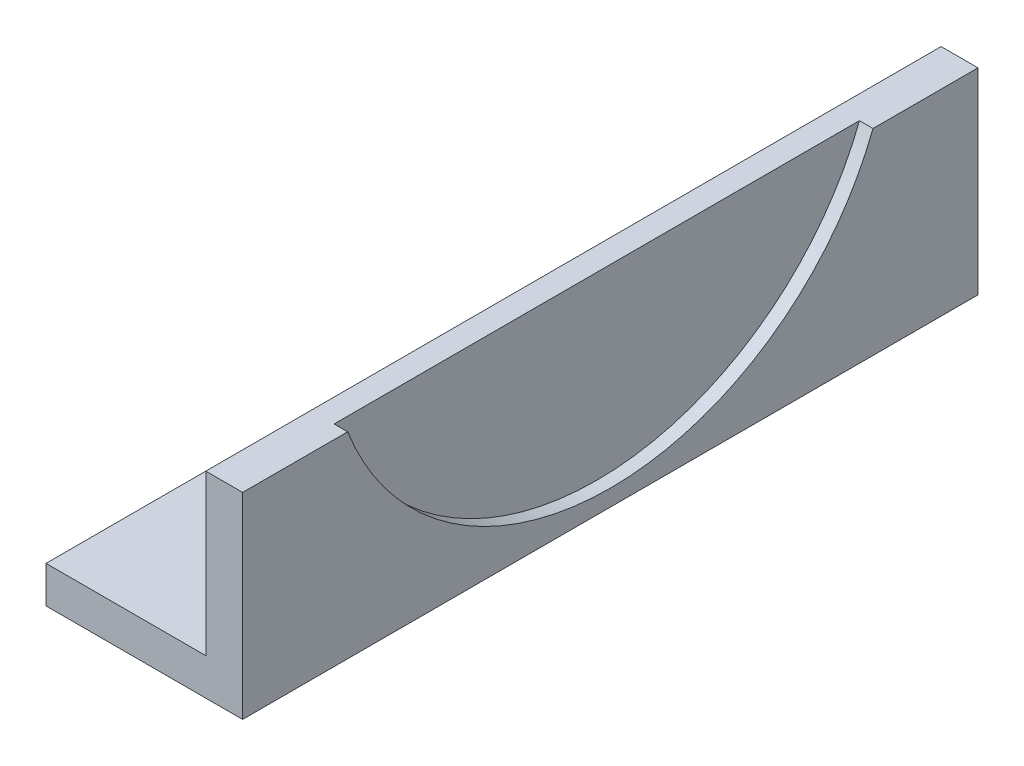
ISO-10303-21;
HEADER;
FILE_DESCRIPTION(('STEP AP214'),'2;1');
FILE_NAME('part.step','',(''),(''),'','','');
FILE_SCHEMA(('AUTOMOTIVE_DESIGN { 1 0 10303 214 1 1 1 1 }'));
ENDSEC;
DATA;
#1=APPLICATION_CONTEXT('core data for automotive mechanical design processes');
#2=APPLICATION_PROTOCOL_DEFINITION('international standard','automotive_design',2000,#1);
#3=PRODUCT_CONTEXT('',#1,'mechanical');
#4=PRODUCT('Part','Part','',(#3));
#5=PRODUCT_RELATED_PRODUCT_CATEGORY('part','',(#4));
#6=PRODUCT_DEFINITION_FORMATION('','',#4);
#7=PRODUCT_DEFINITION_CONTEXT('part definition',#1,'design');
#8=PRODUCT_DEFINITION('design','',#6,#7);
#9=PRODUCT_DEFINITION_SHAPE('','',#8);
#10=(LENGTH_UNIT() NAMED_UNIT(*) SI_UNIT(.MILLI.,.METRE.));
#11=(NAMED_UNIT(*) PLANE_ANGLE_UNIT() SI_UNIT($,.RADIAN.));
#12=(NAMED_UNIT(*) SI_UNIT($,.STERADIAN.) SOLID_ANGLE_UNIT());
#13=UNCERTAINTY_MEASURE_WITH_UNIT(LENGTH_MEASURE(1.E-05),#10,'distance_accuracy_value','');
#14=(GEOMETRIC_REPRESENTATION_CONTEXT(3) GLOBAL_UNCERTAINTY_ASSIGNED_CONTEXT((#13)) GLOBAL_UNIT_ASSIGNED_CONTEXT((#10,
#11,#12)) REPRESENTATION_CONTEXT('',''));
#15=CARTESIAN_POINT('',(0.,0.,0.));
#16=DIRECTION('',(0.,0.,1.));
#17=DIRECTION('',(1.,0.,0.));
#18=AXIS2_PLACEMENT_3D('',#15,#16,#17);
#19=CARTESIAN_POINT('',(25.4,-25.4,190.));
#20=DIRECTION('',(-1.,0.,0.));
#21=DIRECTION('',(0.,0.,1.));
#22=AXIS2_PLACEMENT_3D('',#19,#20,#21);
#23=PLANE('',#22);
#24=DIRECTION('',(0.,0.,-1.));
#25=VECTOR('',#24,1.);
#26=CARTESIAN_POINT('',(25.4,25.4,190.));
#27=LINE('',#26,#25);
#28=CARTESIAN_POINT('',(25.4,25.4,27.1315795085814));
#29=VERTEX_POINT('',#28);
#30=CARTESIAN_POINT('',(25.4,25.4,0.));
#31=VERTEX_POINT('',#30);
#32=EDGE_CURVE('E167',#29,#31,#27,.T.);
#33=ORIENTED_EDGE('',*,*,#32,.F.);
#34=CARTESIAN_POINT('',(25.4,51.5999999999999,95.));
#35=DIRECTION('',(1.,0.,0.));
#36=DIRECTION('',(0.,0.,-1.));
#37=AXIS2_PLACEMENT_3D('',#34,#35,#36);
#38=CIRCLE('',#37,72.75);
#39=CARTESIAN_POINT('',(25.4,25.4,162.868420491419));
#40=VERTEX_POINT('',#39);
#41=EDGE_CURVE('E185',#40,#29,#38,.T.);
#42=ORIENTED_EDGE('',*,*,#41,.F.);
#43=CARTESIAN_POINT('',(25.4,25.4,190.));
#44=VERTEX_POINT('',#43);
#45=EDGE_CURVE('E168',#44,#40,#27,.T.);
#46=ORIENTED_EDGE('',*,*,#45,.F.);
#47=DIRECTION('',(0.,1.,0.));
#48=VECTOR('',#47,1.);
#49=CARTESIAN_POINT('',(25.4,-25.4,190.));
#50=LINE('',#49,#48);
#51=CARTESIAN_POINT('',(25.4,-25.4,190.));
#52=VERTEX_POINT('',#51);
#53=EDGE_CURVE('E156',#52,#44,#50,.T.);
#54=ORIENTED_EDGE('',*,*,#53,.F.);
#55=DIRECTION('',(0.,0.,-1.));
#56=VECTOR('',#55,1.);
#57=CARTESIAN_POINT('',(25.4,-25.4,190.));
#58=LINE('',#57,#56);
#59=CARTESIAN_POINT('',(25.4,-25.4,0.));
#60=VERTEX_POINT('',#59);
#61=EDGE_CURVE('E135',#52,#60,#58,.T.);
#62=ORIENTED_EDGE('',*,*,#61,.T.);
#63=DIRECTION('',(0.,1.,0.));
#64=VECTOR('',#63,1.);
#65=CARTESIAN_POINT('',(25.4,-25.4,0.));
#66=LINE('',#65,#64);
#67=EDGE_CURVE('E139',#60,#31,#66,.T.);
#68=ORIENTED_EDGE('',*,*,#67,.T.);
#69=EDGE_LOOP('',(#33,#42,#46,#54,#62,#68));
#70=FACE_BOUND('',#69,.T.);
#71=ADVANCED_FACE('F39',(#70),#23,.F.);
#72=CARTESIAN_POINT('',(15.875,25.4,190.));
#73=DIRECTION('',(0.,-1.,0.));
#74=DIRECTION('',(0.,0.,-1.));
#75=AXIS2_PLACEMENT_3D('',#72,#73,#74);
#76=PLANE('',#75);
#77=DIRECTION('',(0.,0.,1.));
#78=VECTOR('',#77,1.);
#79=CARTESIAN_POINT('',(21.9,25.4,190.));
#80=LINE('',#79,#78);
#81=CARTESIAN_POINT('',(21.9,25.4,27.1315795085814));
#82=VERTEX_POINT('',#81);
#83=CARTESIAN_POINT('',(21.9,25.4,162.868420491419));
#84=VERTEX_POINT('',#83);
#85=EDGE_CURVE('E171',#82,#84,#80,.T.);
#86=ORIENTED_EDGE('',*,*,#85,.F.);
#87=DIRECTION('',(1.,0.,0.));
#88=VECTOR('',#87,1.);
#89=CARTESIAN_POINT('',(21.9,25.4,27.1315795085814));
#90=LINE('',#89,#88);
#91=EDGE_CURVE('E11',#82,#29,#90,.T.);
#92=ORIENTED_EDGE('',*,*,#91,.T.);
#93=ORIENTED_EDGE('',*,*,#32,.T.);
#94=DIRECTION('',(-1.,0.,0.));
#95=VECTOR('',#94,1.);
#96=CARTESIAN_POINT('',(15.875,25.4,0.));
#97=LINE('',#96,#95);
#98=CARTESIAN_POINT('',(15.875,25.4,0.));
#99=VERTEX_POINT('',#98);
#100=EDGE_CURVE('E143',#31,#99,#97,.T.);
#101=ORIENTED_EDGE('',*,*,#100,.T.);
#102=DIRECTION('',(0.,0.,-1.));
#103=VECTOR('',#102,1.);
#104=CARTESIAN_POINT('',(15.875,25.4,190.));
#105=LINE('',#104,#103);
#106=CARTESIAN_POINT('',(15.875,25.4,190.));
#107=VERTEX_POINT('',#106);
#108=EDGE_CURVE('E163',#107,#99,#105,.T.);
#109=ORIENTED_EDGE('',*,*,#108,.F.);
#110=DIRECTION('',(-1.,0.,0.));
#111=VECTOR('',#110,1.);
#112=CARTESIAN_POINT('',(15.875,25.4,190.));
#113=LINE('',#112,#111);
#114=EDGE_CURVE('E98',#44,#107,#113,.T.);
#115=ORIENTED_EDGE('',*,*,#114,.F.);
#116=ORIENTED_EDGE('',*,*,#45,.T.);
#117=DIRECTION('',(1.,0.,0.));
#118=VECTOR('',#117,1.);
#119=CARTESIAN_POINT('',(21.9,25.4,162.868420491419));
#120=LINE('',#119,#118);
#121=EDGE_CURVE('E47',#40,#84,#120,.F.);
#122=ORIENTED_EDGE('',*,*,#121,.T.);
#123=EDGE_LOOP('',(#86,#92,#93,#101,#109,#115,#116,#122));
#124=FACE_BOUND('',#123,.T.);
#125=ADVANCED_FACE('F177',(#124),#76,.F.);
#126=CARTESIAN_POINT('',(15.875,25.4,190.));
#127=DIRECTION('',(1.,0.,0.));
#128=DIRECTION('',(0.,1.,0.));
#129=AXIS2_PLACEMENT_3D('',#126,#127,#128);
#130=PLANE('',#129);
#131=DIRECTION('',(0.,-1.,0.));
#132=VECTOR('',#131,1.);
#133=CARTESIAN_POINT('',(15.875,25.4,0.));
#134=LINE('',#133,#132);
#135=CARTESIAN_POINT('',(15.875,-15.875,0.));
#136=VERTEX_POINT('',#135);
#137=EDGE_CURVE('E146',#99,#136,#134,.T.);
#138=ORIENTED_EDGE('',*,*,#137,.T.);
#139=DIRECTION('',(0.,0.,-1.));
#140=VECTOR('',#139,1.);
#141=CARTESIAN_POINT('',(15.875,-15.875,190.));
#142=LINE('',#141,#140);
#143=CARTESIAN_POINT('',(15.875,-15.875,190.));
#144=VERTEX_POINT('',#143);
#145=EDGE_CURVE('E128',#144,#136,#142,.T.);
#146=ORIENTED_EDGE('',*,*,#145,.F.);
#147=DIRECTION('',(0.,-1.,0.));
#148=VECTOR('',#147,1.);
#149=CARTESIAN_POINT('',(15.875,25.4,190.));
#150=LINE('',#149,#148);
#151=EDGE_CURVE('E114',#107,#144,#150,.T.);
#152=ORIENTED_EDGE('',*,*,#151,.F.);
#153=ORIENTED_EDGE('',*,*,#108,.T.);
#154=EDGE_LOOP('',(#138,#146,#152,#153));
#155=FACE_BOUND('',#154,.T.);
#156=ADVANCED_FACE('F202',(#155),#130,.F.);
#157=CARTESIAN_POINT('',(-25.4,-15.875,190.));
#158=DIRECTION('',(0.,-1.,0.));
#159=DIRECTION('',(0.,0.,-1.));
#160=AXIS2_PLACEMENT_3D('',#157,#158,#159);
#161=PLANE('',#160);
#162=DIRECTION('',(-1.,0.,0.));
#163=VECTOR('',#162,1.);
#164=CARTESIAN_POINT('',(-25.4,-15.875,0.));
#165=LINE('',#164,#163);
#166=CARTESIAN_POINT('',(-25.4,-15.875,0.));
#167=VERTEX_POINT('',#166);
#168=EDGE_CURVE('E124',#136,#167,#165,.T.);
#169=ORIENTED_EDGE('',*,*,#168,.T.);
#170=DIRECTION('',(0.,0.,-1.));
#171=VECTOR('',#170,1.);
#172=CARTESIAN_POINT('',(-25.4,-15.875,190.));
#173=LINE('',#172,#171);
#174=CARTESIAN_POINT('',(-25.4,-15.875,190.));
#175=VERTEX_POINT('',#174);
#176=EDGE_CURVE('E121',#175,#167,#173,.T.);
#177=ORIENTED_EDGE('',*,*,#176,.F.);
#178=DIRECTION('',(-1.,0.,0.));
#179=VECTOR('',#178,1.);
#180=CARTESIAN_POINT('',(-25.4,-15.875,190.));
#181=LINE('',#180,#179);
#182=EDGE_CURVE('E107',#144,#175,#181,.T.);
#183=ORIENTED_EDGE('',*,*,#182,.F.);
#184=ORIENTED_EDGE('',*,*,#145,.T.);
#185=EDGE_LOOP('',(#169,#177,#183,#184));
#186=FACE_BOUND('',#185,.T.);
#187=ADVANCED_FACE('F122',(#186),#161,.F.);
#188=CARTESIAN_POINT('',(-25.4,-25.4,190.));
#189=DIRECTION('',(1.,0.,0.));
#190=DIRECTION('',(0.,1.,0.));
#191=AXIS2_PLACEMENT_3D('',#188,#189,#190);
#192=PLANE('',#191);
#193=DIRECTION('',(0.,-1.,0.));
#194=VECTOR('',#193,1.);
#195=CARTESIAN_POINT('',(-25.4,-25.4,0.));
#196=LINE('',#195,#194);
#197=CARTESIAN_POINT('',(-25.4,-25.4,0.));
#198=VERTEX_POINT('',#197);
#199=EDGE_CURVE('E151',#167,#198,#196,.T.);
#200=ORIENTED_EDGE('',*,*,#199,.T.);
#201=DIRECTION('',(0.,0.,-1.));
#202=VECTOR('',#201,1.);
#203=CARTESIAN_POINT('',(-25.4,-25.4,190.));
#204=LINE('',#203,#202);
#205=CARTESIAN_POINT('',(-25.4,-25.4,190.));
#206=VERTEX_POINT('',#205);
#207=EDGE_CURVE('E129',#206,#198,#204,.T.);
#208=ORIENTED_EDGE('',*,*,#207,.F.);
#209=DIRECTION('',(0.,-1.,0.));
#210=VECTOR('',#209,1.);
#211=CARTESIAN_POINT('',(-25.4,-25.4,190.));
#212=LINE('',#211,#210);
#213=EDGE_CURVE('E111',#175,#206,#212,.T.);
#214=ORIENTED_EDGE('',*,*,#213,.F.);
#215=ORIENTED_EDGE('',*,*,#176,.T.);
#216=EDGE_LOOP('',(#200,#208,#214,#215));
#217=FACE_BOUND('',#216,.T.);
#218=ADVANCED_FACE('F131',(#217),#192,.F.);
#219=CARTESIAN_POINT('',(-25.4,-25.4,190.));
#220=DIRECTION('',(0.,1.,0.));
#221=DIRECTION('',(0.,0.,1.));
#222=AXIS2_PLACEMENT_3D('',#219,#220,#221);
#223=PLANE('',#222);
#224=DIRECTION('',(1.,0.,0.));
#225=VECTOR('',#224,1.);
#226=CARTESIAN_POINT('',(-25.4,-25.4,0.));
#227=LINE('',#226,#225);
#228=EDGE_CURVE('E89',#198,#60,#227,.T.);
#229=ORIENTED_EDGE('',*,*,#228,.T.);
#230=ORIENTED_EDGE('',*,*,#61,.F.);
#231=DIRECTION('',(1.,0.,0.));
#232=VECTOR('',#231,1.);
#233=CARTESIAN_POINT('',(-25.4,-25.4,190.));
#234=LINE('',#233,#232);
#235=EDGE_CURVE('E62',#206,#52,#234,.T.);
#236=ORIENTED_EDGE('',*,*,#235,.F.);
#237=ORIENTED_EDGE('',*,*,#207,.T.);
#238=EDGE_LOOP('',(#229,#230,#236,#237));
#239=FACE_BOUND('',#238,.T.);
#240=ADVANCED_FACE('F206',(#239),#223,.F.);
#241=CARTESIAN_POINT('',(0.,0.,190.));
#242=DIRECTION('',(0.,0.,-1.));
#243=DIRECTION('',(-1.,0.,0.));
#244=AXIS2_PLACEMENT_3D('',#241,#242,#243);
#245=PLANE('',#244);
#246=ORIENTED_EDGE('',*,*,#53,.T.);
#247=ORIENTED_EDGE('',*,*,#114,.T.);
#248=ORIENTED_EDGE('',*,*,#151,.T.);
#249=ORIENTED_EDGE('',*,*,#182,.T.);
#250=ORIENTED_EDGE('',*,*,#213,.T.);
#251=ORIENTED_EDGE('',*,*,#235,.T.);
#252=EDGE_LOOP('',(#246,#247,#248,#249,#250,#251));
#253=FACE_BOUND('',#252,.T.);
#254=ADVANCED_FACE('F109',(#253),#245,.F.);
#255=CARTESIAN_POINT('',(0.,0.,0.));
#256=DIRECTION('',(0.,0.,-1.));
#257=DIRECTION('',(-1.,0.,0.));
#258=AXIS2_PLACEMENT_3D('',#255,#256,#257);
#259=PLANE('',#258);
#260=ORIENTED_EDGE('',*,*,#67,.F.);
#261=ORIENTED_EDGE('',*,*,#228,.F.);
#262=ORIENTED_EDGE('',*,*,#199,.F.);
#263=ORIENTED_EDGE('',*,*,#168,.F.);
#264=ORIENTED_EDGE('',*,*,#137,.F.);
#265=ORIENTED_EDGE('',*,*,#100,.F.);
#266=EDGE_LOOP('',(#260,#261,#262,#263,#264,#265));
#267=FACE_BOUND('',#266,.T.);
#268=ADVANCED_FACE('F205',(#267),#259,.T.);
#269=CARTESIAN_POINT('',(21.9,51.5999999999999,95.));
#270=DIRECTION('',(1.,0.,0.));
#271=DIRECTION('',(0.,0.,-1.));
#272=AXIS2_PLACEMENT_3D('',#269,#270,#271);
#273=CYLINDRICAL_SURFACE('',#272,72.75);
#274=CARTESIAN_POINT('',(21.9,51.5999999999999,95.));
#275=DIRECTION('',(1.,0.,0.));
#276=DIRECTION('',(0.,0.,-1.));
#277=AXIS2_PLACEMENT_3D('',#274,#275,#276);
#278=CIRCLE('',#277,72.75);
#279=EDGE_CURVE('E53',#84,#82,#278,.T.);
#280=ORIENTED_EDGE('',*,*,#279,.F.);
#281=ORIENTED_EDGE('',*,*,#121,.F.);
#282=ORIENTED_EDGE('',*,*,#41,.T.);
#283=ORIENTED_EDGE('',*,*,#91,.F.);
#284=EDGE_LOOP('',(#280,#281,#282,#283));
#285=FACE_BOUND('',#284,.T.);
#286=ADVANCED_FACE('F184',(#285),#273,.F.);
#287=CARTESIAN_POINT('',(21.9,51.5999999999999,95.));
#288=DIRECTION('',(1.,0.,0.));
#289=DIRECTION('',(0.,0.,-1.));
#290=AXIS2_PLACEMENT_3D('',#287,#288,#289);
#291=PLANE('',#290);
#292=ORIENTED_EDGE('',*,*,#85,.T.);
#293=ORIENTED_EDGE('',*,*,#279,.T.);
#294=EDGE_LOOP('',(#292,#293));
#295=FACE_BOUND('',#294,.T.);
#296=ADVANCED_FACE('F269',(#295),#291,.T.);
#297=CLOSED_SHELL('',(#71,#125,#156,#187,#218,#240,#254,#268,#286,#296));
#298=MANIFOLD_SOLID_BREP('B2',#297);
#299=ADVANCED_BREP_SHAPE_REPRESENTATION('',(#18,#298),#14);
#300=SHAPE_DEFINITION_REPRESENTATION(#9,#299);
ENDSEC;
END-ISO-10303-21;
